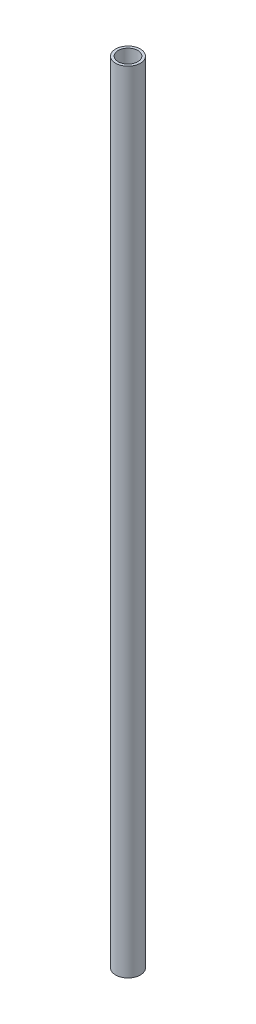
ISO-10303-21;
HEADER;
FILE_DESCRIPTION(('STEP AP214'),'2;1');
FILE_NAME('part.step','',(''),(''),'','','');
FILE_SCHEMA(('AUTOMOTIVE_DESIGN { 1 0 10303 214 1 1 1 1 }'));
ENDSEC;
DATA;
#1=APPLICATION_CONTEXT('core data for automotive mechanical design processes');
#2=APPLICATION_PROTOCOL_DEFINITION('international standard','automotive_design',2000,#1);
#3=PRODUCT_CONTEXT('',#1,'mechanical');
#4=PRODUCT('Part','Part','',(#3));
#5=PRODUCT_RELATED_PRODUCT_CATEGORY('part','',(#4));
#6=PRODUCT_DEFINITION_FORMATION('','',#4);
#7=PRODUCT_DEFINITION_CONTEXT('part definition',#1,'design');
#8=PRODUCT_DEFINITION('design','',#6,#7);
#9=PRODUCT_DEFINITION_SHAPE('','',#8);
#10=(LENGTH_UNIT() NAMED_UNIT(*) SI_UNIT(.MILLI.,.METRE.));
#11=(NAMED_UNIT(*) PLANE_ANGLE_UNIT() SI_UNIT($,.RADIAN.));
#12=(NAMED_UNIT(*) SI_UNIT($,.STERADIAN.) SOLID_ANGLE_UNIT());
#13=UNCERTAINTY_MEASURE_WITH_UNIT(LENGTH_MEASURE(1.E-05),#10,'distance_accuracy_value','');
#14=(GEOMETRIC_REPRESENTATION_CONTEXT(3) GLOBAL_UNCERTAINTY_ASSIGNED_CONTEXT((#13)) GLOBAL_UNIT_ASSIGNED_CONTEXT((#10,
#11,#12)) REPRESENTATION_CONTEXT('',''));
#15=CARTESIAN_POINT('',(0.,0.,0.));
#16=DIRECTION('',(0.,0.,1.));
#17=DIRECTION('',(1.,0.,0.));
#18=AXIS2_PLACEMENT_3D('',#15,#16,#17);
#19=CARTESIAN_POINT('',(0.,507.,0.));
#20=DIRECTION('',(0.,1.,0.));
#21=DIRECTION('',(0.,0.,1.));
#22=AXIS2_PLACEMENT_3D('',#19,#20,#21);
#23=PLANE('',#22);
#24=CARTESIAN_POINT('',(0.,507.,0.));
#25=DIRECTION('',(0.,1.,0.));
#26=DIRECTION('',(0.,0.,1.));
#27=AXIS2_PLACEMENT_3D('',#24,#25,#26);
#28=CIRCLE('',#27,7.9375);
#29=CARTESIAN_POINT('',(0.,507.,7.9375));
#30=VERTEX_POINT('',#29);
#31=EDGE_CURVE('E10',#30,#30,#28,.T.);
#32=ORIENTED_EDGE('',*,*,#31,.T.);
#33=EDGE_LOOP('',(#32));
#34=FACE_BOUND('',#33,.T.);
#35=CARTESIAN_POINT('',(0.,507.,0.));
#36=DIRECTION('',(0.,1.,0.));
#37=DIRECTION('',(0.,0.,1.));
#38=AXIS2_PLACEMENT_3D('',#35,#36,#37);
#39=CIRCLE('',#38,6.2865);
#40=CARTESIAN_POINT('',(0.,507.,6.2865));
#41=VERTEX_POINT('',#40);
#42=EDGE_CURVE('E42',#41,#41,#39,.T.);
#43=ORIENTED_EDGE('',*,*,#42,.F.);
#44=EDGE_LOOP('',(#43));
#45=FACE_BOUND('',#44,.T.);
#46=ADVANCED_FACE('F31',(#34,#45),#23,.T.);
#47=CARTESIAN_POINT('',(0.,0.,0.));
#48=DIRECTION('',(0.,1.,0.));
#49=DIRECTION('',(0.,0.,1.));
#50=AXIS2_PLACEMENT_3D('',#47,#48,#49);
#51=PLANE('',#50);
#52=CARTESIAN_POINT('',(0.,0.,0.));
#53=DIRECTION('',(0.,1.,0.));
#54=DIRECTION('',(0.,0.,1.));
#55=AXIS2_PLACEMENT_3D('',#52,#53,#54);
#56=CIRCLE('',#55,7.9375);
#57=CARTESIAN_POINT('',(0.,0.,7.9375));
#58=VERTEX_POINT('',#57);
#59=EDGE_CURVE('E35',#58,#58,#56,.T.);
#60=ORIENTED_EDGE('',*,*,#59,.F.);
#61=EDGE_LOOP('',(#60));
#62=FACE_BOUND('',#61,.T.);
#63=CARTESIAN_POINT('',(0.,0.,0.));
#64=DIRECTION('',(0.,1.,0.));
#65=DIRECTION('',(0.,0.,1.));
#66=AXIS2_PLACEMENT_3D('',#63,#64,#65);
#67=CIRCLE('',#66,6.2865);
#68=CARTESIAN_POINT('',(0.,0.,6.2865));
#69=VERTEX_POINT('',#68);
#70=EDGE_CURVE('E44',#69,#69,#67,.T.);
#71=ORIENTED_EDGE('',*,*,#70,.T.);
#72=EDGE_LOOP('',(#71));
#73=FACE_BOUND('',#72,.T.);
#74=ADVANCED_FACE('F54',(#62,#73),#51,.F.);
#75=CARTESIAN_POINT('',(0.,507.,0.));
#76=DIRECTION('',(0.,-1.,0.));
#77=DIRECTION('',(0.,0.,-1.));
#78=AXIS2_PLACEMENT_3D('',#75,#76,#77);
#79=CYLINDRICAL_SURFACE('',#78,7.9375);
#80=ORIENTED_EDGE('',*,*,#31,.F.);
#81=EDGE_LOOP('',(#80));
#82=FACE_BOUND('',#81,.T.);
#83=ORIENTED_EDGE('',*,*,#59,.T.);
#84=EDGE_LOOP('',(#83));
#85=FACE_BOUND('',#84,.T.);
#86=ADVANCED_FACE('F33',(#82,#85),#79,.T.);
#87=CARTESIAN_POINT('',(0.,507.,0.));
#88=DIRECTION('',(0.,-1.,0.));
#89=DIRECTION('',(0.,0.,-1.));
#90=AXIS2_PLACEMENT_3D('',#87,#88,#89);
#91=CYLINDRICAL_SURFACE('',#90,6.2865);
#92=ORIENTED_EDGE('',*,*,#42,.T.);
#93=EDGE_LOOP('',(#92));
#94=FACE_BOUND('',#93,.T.);
#95=ORIENTED_EDGE('',*,*,#70,.F.);
#96=EDGE_LOOP('',(#95));
#97=FACE_BOUND('',#96,.T.);
#98=ADVANCED_FACE('F50',(#94,#97),#91,.F.);
#99=CLOSED_SHELL('',(#46,#74,#86,#98));
#100=MANIFOLD_SOLID_BREP('B2',#99);
#101=ADVANCED_BREP_SHAPE_REPRESENTATION('',(#18,#100),#14);
#102=SHAPE_DEFINITION_REPRESENTATION(#9,#101);
ENDSEC;
END-ISO-10303-21;
